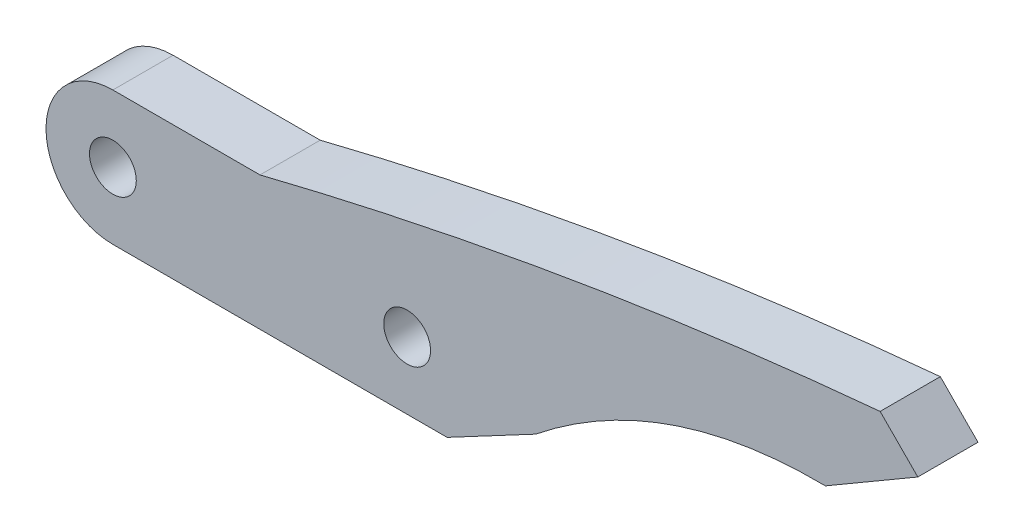
ISO-10303-21;
HEADER;
FILE_DESCRIPTION(('STEP AP214'),'2;1');
FILE_NAME('part.step','',(''),(''),'','','');
FILE_SCHEMA(('AUTOMOTIVE_DESIGN { 1 0 10303 214 1 1 1 1 }'));
ENDSEC;
DATA;
#1=APPLICATION_CONTEXT('core data for automotive mechanical design processes');
#2=APPLICATION_PROTOCOL_DEFINITION('international standard','automotive_design',2000,#1);
#3=PRODUCT_CONTEXT('',#1,'mechanical');
#4=PRODUCT('Part','Part','',(#3));
#5=PRODUCT_RELATED_PRODUCT_CATEGORY('part','',(#4));
#6=PRODUCT_DEFINITION_FORMATION('','',#4);
#7=PRODUCT_DEFINITION_CONTEXT('part definition',#1,'design');
#8=PRODUCT_DEFINITION('design','',#6,#7);
#9=PRODUCT_DEFINITION_SHAPE('','',#8);
#10=(LENGTH_UNIT() NAMED_UNIT(*) SI_UNIT(.MILLI.,.METRE.));
#11=(NAMED_UNIT(*) PLANE_ANGLE_UNIT() SI_UNIT($,.RADIAN.));
#12=(NAMED_UNIT(*) SI_UNIT($,.STERADIAN.) SOLID_ANGLE_UNIT());
#13=UNCERTAINTY_MEASURE_WITH_UNIT(LENGTH_MEASURE(1.E-05),#10,'distance_accuracy_value','');
#14=(GEOMETRIC_REPRESENTATION_CONTEXT(3) GLOBAL_UNCERTAINTY_ASSIGNED_CONTEXT((#13)) GLOBAL_UNIT_ASSIGNED_CONTEXT((#10,
#11,#12)) REPRESENTATION_CONTEXT('',''));
#15=CARTESIAN_POINT('',(0.,0.,0.));
#16=DIRECTION('',(0.,0.,1.));
#17=DIRECTION('',(1.,0.,0.));
#18=AXIS2_PLACEMENT_3D('',#15,#16,#17);
#19=CARTESIAN_POINT('',(0.,5.,-4.5));
#20=DIRECTION('',(0.,-1.,0.));
#21=DIRECTION('',(0.,0.,-1.));
#22=AXIS2_PLACEMENT_3D('',#19,#20,#21);
#23=PLANE('',#22);
#24=DIRECTION('',(0.,0.,1.));
#25=VECTOR('',#24,1.);
#26=CARTESIAN_POINT('',(0.,5.,-56.8267387246767));
#27=LINE('',#26,#25);
#28=CARTESIAN_POINT('',(0.,5.,-4.5));
#29=VERTEX_POINT('',#28);
#30=CARTESIAN_POINT('',(0.,5.,0.));
#31=VERTEX_POINT('',#30);
#32=EDGE_CURVE('E54',#29,#31,#27,.T.);
#33=ORIENTED_EDGE('',*,*,#32,.F.);
#34=DIRECTION('',(1.,0.,0.));
#35=VECTOR('',#34,1.);
#36=CARTESIAN_POINT('',(0.,5.,-4.5));
#37=LINE('',#36,#35);
#38=CARTESIAN_POINT('',(-11.,5.,-4.5));
#39=VERTEX_POINT('',#38);
#40=EDGE_CURVE('E75',#39,#29,#37,.T.);
#41=ORIENTED_EDGE('',*,*,#40,.F.);
#42=DIRECTION('',(0.,0.,1.));
#43=VECTOR('',#42,1.);
#44=CARTESIAN_POINT('',(-11.,5.,-4.5));
#45=LINE('',#44,#43);
#46=CARTESIAN_POINT('',(-11.,5.,0.));
#47=VERTEX_POINT('',#46);
#48=EDGE_CURVE('E11',#39,#47,#45,.T.);
#49=ORIENTED_EDGE('',*,*,#48,.T.);
#50=DIRECTION('',(1.,0.,0.));
#51=VECTOR('',#50,1.);
#52=CARTESIAN_POINT('',(0.,5.,0.));
#53=LINE('',#52,#51);
#54=EDGE_CURVE('E72',#47,#31,#53,.T.);
#55=ORIENTED_EDGE('',*,*,#54,.T.);
#56=EDGE_LOOP('',(#33,#41,#49,#55));
#57=FACE_BOUND('',#56,.T.);
#58=ADVANCED_FACE('F37',(#57),#23,.F.);
#59=CARTESIAN_POINT('',(-11.,0.,-4.5));
#60=DIRECTION('',(0.,0.,1.));
#61=DIRECTION('',(1.,0.,0.));
#62=AXIS2_PLACEMENT_3D('',#59,#60,#61);
#63=CYLINDRICAL_SURFACE('',#62,5.);
#64=CARTESIAN_POINT('',(-11.,0.,0.));
#65=DIRECTION('',(0.,0.,1.));
#66=DIRECTION('',(1.,0.,0.));
#67=AXIS2_PLACEMENT_3D('',#64,#65,#66);
#68=CIRCLE('',#67,5.);
#69=CARTESIAN_POINT('',(-11.,-5.,0.));
#70=VERTEX_POINT('',#69);
#71=EDGE_CURVE('E81',#47,#70,#68,.T.);
#72=ORIENTED_EDGE('',*,*,#71,.F.);
#73=ORIENTED_EDGE('',*,*,#48,.F.);
#74=CARTESIAN_POINT('',(-11.,0.,-4.5));
#75=DIRECTION('',(0.,0.,1.));
#76=DIRECTION('',(1.,0.,0.));
#77=AXIS2_PLACEMENT_3D('',#74,#75,#76);
#78=CIRCLE('',#77,5.);
#79=CARTESIAN_POINT('',(-11.,-5.,-4.5));
#80=VERTEX_POINT('',#79);
#81=EDGE_CURVE('E101',#39,#80,#78,.T.);
#82=ORIENTED_EDGE('',*,*,#81,.T.);
#83=DIRECTION('',(0.,0.,1.));
#84=VECTOR('',#83,1.);
#85=CARTESIAN_POINT('',(-11.,-5.,-4.5));
#86=LINE('',#85,#84);
#87=EDGE_CURVE('E42',#80,#70,#86,.T.);
#88=ORIENTED_EDGE('',*,*,#87,.T.);
#89=EDGE_LOOP('',(#72,#73,#82,#88));
#90=FACE_BOUND('',#89,.T.);
#91=ADVANCED_FACE('F90',(#90),#63,.T.);
#92=CARTESIAN_POINT('',(0.,-5.,-4.5));
#93=DIRECTION('',(0.,-1.,0.));
#94=DIRECTION('',(0.,0.,-1.));
#95=AXIS2_PLACEMENT_3D('',#92,#93,#94);
#96=PLANE('',#95);
#97=DIRECTION('',(1.,0.,0.));
#98=VECTOR('',#97,1.);
#99=CARTESIAN_POINT('',(0.,-5.,0.));
#100=LINE('',#99,#98);
#101=CARTESIAN_POINT('',(13.99,-5.,0.));
#102=VERTEX_POINT('',#101);
#103=EDGE_CURVE('E89',#70,#102,#100,.T.);
#104=ORIENTED_EDGE('',*,*,#103,.F.);
#105=ORIENTED_EDGE('',*,*,#87,.F.);
#106=DIRECTION('',(1.,0.,0.));
#107=VECTOR('',#106,1.);
#108=CARTESIAN_POINT('',(0.,-5.,-4.5));
#109=LINE('',#108,#107);
#110=CARTESIAN_POINT('',(13.99,-5.,-4.5));
#111=VERTEX_POINT('',#110);
#112=EDGE_CURVE('E110',#80,#111,#109,.T.);
#113=ORIENTED_EDGE('',*,*,#112,.T.);
#114=DIRECTION('',(0.,0.,1.));
#115=VECTOR('',#114,1.);
#116=CARTESIAN_POINT('',(13.99,-5.,-56.8267387246767));
#117=LINE('',#116,#115);
#118=EDGE_CURVE('E153',#111,#102,#117,.T.);
#119=ORIENTED_EDGE('',*,*,#118,.T.);
#120=EDGE_LOOP('',(#104,#105,#113,#119));
#121=FACE_BOUND('',#120,.T.);
#122=ADVANCED_FACE('F136',(#121),#96,.T.);
#123=CARTESIAN_POINT('',(-11.,0.,-4.5));
#124=DIRECTION('',(0.,0.,1.));
#125=DIRECTION('',(1.,0.,0.));
#126=AXIS2_PLACEMENT_3D('',#123,#124,#125);
#127=CYLINDRICAL_SURFACE('',#126,1.75);
#128=CARTESIAN_POINT('',(-11.,0.,-4.5));
#129=DIRECTION('',(0.,0.,1.));
#130=DIRECTION('',(1.,0.,0.));
#131=AXIS2_PLACEMENT_3D('',#128,#129,#130);
#132=CIRCLE('',#131,1.75);
#133=CARTESIAN_POINT('',(-9.25,0.,-4.5));
#134=VERTEX_POINT('',#133);
#135=EDGE_CURVE('E99',#134,#134,#132,.T.);
#136=ORIENTED_EDGE('',*,*,#135,.F.);
#137=EDGE_LOOP('',(#136));
#138=FACE_BOUND('',#137,.T.);
#139=CARTESIAN_POINT('',(-11.,0.,0.));
#140=DIRECTION('',(0.,0.,1.));
#141=DIRECTION('',(1.,0.,0.));
#142=AXIS2_PLACEMENT_3D('',#139,#140,#141);
#143=CIRCLE('',#142,1.75);
#144=CARTESIAN_POINT('',(-9.25,0.,0.));
#145=VERTEX_POINT('',#144);
#146=EDGE_CURVE('E91',#145,#145,#143,.T.);
#147=ORIENTED_EDGE('',*,*,#146,.T.);
#148=EDGE_LOOP('',(#147));
#149=FACE_BOUND('',#148,.T.);
#150=ADVANCED_FACE('F45',(#138,#149),#127,.F.);
#151=CARTESIAN_POINT('',(11.,0.,-4.5));
#152=DIRECTION('',(0.,0.,1.));
#153=DIRECTION('',(1.,0.,0.));
#154=AXIS2_PLACEMENT_3D('',#151,#152,#153);
#155=CYLINDRICAL_SURFACE('',#154,1.75);
#156=CARTESIAN_POINT('',(11.,0.,-4.5));
#157=DIRECTION('',(0.,0.,1.));
#158=DIRECTION('',(1.,0.,0.));
#159=AXIS2_PLACEMENT_3D('',#156,#157,#158);
#160=CIRCLE('',#159,1.75);
#161=CARTESIAN_POINT('',(12.75,0.,-4.5));
#162=VERTEX_POINT('',#161);
#163=EDGE_CURVE('E112',#162,#162,#160,.F.);
#164=ORIENTED_EDGE('',*,*,#163,.T.);
#165=EDGE_LOOP('',(#164));
#166=FACE_BOUND('',#165,.T.);
#167=CARTESIAN_POINT('',(11.,0.,0.));
#168=DIRECTION('',(0.,0.,1.));
#169=DIRECTION('',(1.,0.,0.));
#170=AXIS2_PLACEMENT_3D('',#167,#168,#169);
#171=CIRCLE('',#170,1.75);
#172=CARTESIAN_POINT('',(12.75,0.,0.));
#173=VERTEX_POINT('',#172);
#174=EDGE_CURVE('E88',#173,#173,#171,.F.);
#175=ORIENTED_EDGE('',*,*,#174,.F.);
#176=EDGE_LOOP('',(#175));
#177=FACE_BOUND('',#176,.T.);
#178=ADVANCED_FACE('F117',(#166,#177),#155,.F.);
#179=CARTESIAN_POINT('',(0.,0.,-4.5));
#180=DIRECTION('',(0.,0.,1.));
#181=DIRECTION('',(1.,0.,0.));
#182=AXIS2_PLACEMENT_3D('',#179,#180,#181);
#183=PLANE('',#182);
#184=ORIENTED_EDGE('',*,*,#40,.T.);
#185=CARTESIAN_POINT('',(46.3639891994318,12.87,-4.5));
#186=CARTESIAN_POINT('',(22.8855175011126,10.7079266509718,-4.5));
#187=CARTESIAN_POINT('',(0.,5.,-4.5));
#188=B_SPLINE_CURVE_WITH_KNOTS('',2,(#185,#186,#187),.UNSPECIFIED.,.F.,.F.,(3,3),(0.,1.),.UNSPECIFIED.);
#189=CARTESIAN_POINT('',(46.3639891994318,12.87,-4.5));
#190=VERTEX_POINT('',#189);
#191=EDGE_CURVE('E94',#29,#190,#188,.F.);
#192=ORIENTED_EDGE('',*,*,#191,.T.);
#193=DIRECTION('',(0.70420167565833,-0.71,0.));
#194=VECTOR('',#193,1.);
#195=CARTESIAN_POINT('',(46.3639891994318,12.87,-4.5));
#196=LINE('',#195,#194);
#197=CARTESIAN_POINT('',(49.1807959020651,10.03,-4.5));
#198=VERTEX_POINT('',#197);
#199=EDGE_CURVE('E183',#190,#198,#196,.T.);
#200=ORIENTED_EDGE('',*,*,#199,.T.);
#201=DIRECTION('',(-0.86384948775814,-0.50375,0.));
#202=VECTOR('',#201,1.);
#203=CARTESIAN_POINT('',(49.1807959020651,10.03,-4.5));
#204=LINE('',#203,#202);
#205=CARTESIAN_POINT('',(42.27,6.,-4.5));
#206=VERTEX_POINT('',#205);
#207=EDGE_CURVE('E192',#198,#206,#204,.T.);
#208=ORIENTED_EDGE('',*,*,#207,.T.);
#209=CARTESIAN_POINT('',(20.61,-1.48,-4.5));
#210=CARTESIAN_POINT('',(30.1461507480521,6.15734830451268,-4.5));
#211=CARTESIAN_POINT('',(42.27,6.,-4.5));
#212=B_SPLINE_CURVE_WITH_KNOTS('',2,(#209,#210,#211),.UNSPECIFIED.,.F.,.F.,(3,3),(0.,1.),.UNSPECIFIED.);
#213=CARTESIAN_POINT('',(20.61,-1.48,-4.5));
#214=VERTEX_POINT('',#213);
#215=EDGE_CURVE('E196',#206,#214,#212,.F.);
#216=ORIENTED_EDGE('',*,*,#215,.T.);
#217=DIRECTION('',(-0.882942972945771,-0.469480251475697,0.));
#218=VECTOR('',#217,1.);
#219=CARTESIAN_POINT('',(20.61,-1.48,-4.5));
#220=LINE('',#219,#218);
#221=EDGE_CURVE('E199',#214,#111,#220,.T.);
#222=ORIENTED_EDGE('',*,*,#221,.T.);
#223=ORIENTED_EDGE('',*,*,#112,.F.);
#224=ORIENTED_EDGE('',*,*,#81,.F.);
#225=EDGE_LOOP('',(#184,#192,#200,#208,#216,#222,#223,#224));
#226=FACE_BOUND('',#225,.T.);
#227=ORIENTED_EDGE('',*,*,#135,.T.);
#228=EDGE_LOOP('',(#227));
#229=FACE_BOUND('',#228,.T.);
#230=ORIENTED_EDGE('',*,*,#163,.F.);
#231=EDGE_LOOP('',(#230));
#232=FACE_BOUND('',#231,.T.);
#233=ADVANCED_FACE('F122',(#226,#229,#232),#183,.F.);
#234=CARTESIAN_POINT('',(0.,0.,0.));
#235=DIRECTION('',(0.,0.,1.));
#236=DIRECTION('',(1.,0.,0.));
#237=AXIS2_PLACEMENT_3D('',#234,#235,#236);
#238=PLANE('',#237);
#239=ORIENTED_EDGE('',*,*,#146,.F.);
#240=EDGE_LOOP('',(#239));
#241=FACE_BOUND('',#240,.T.);
#242=ORIENTED_EDGE('',*,*,#71,.T.);
#243=ORIENTED_EDGE('',*,*,#103,.T.);
#244=DIRECTION('',(0.882942972945771,0.469480251475697,0.));
#245=VECTOR('',#244,1.);
#246=CARTESIAN_POINT('',(20.61,-1.48,0.));
#247=LINE('',#246,#245);
#248=CARTESIAN_POINT('',(20.61,-1.48,0.));
#249=VERTEX_POINT('',#248);
#250=EDGE_CURVE('E156',#102,#249,#247,.T.);
#251=ORIENTED_EDGE('',*,*,#250,.T.);
#252=CARTESIAN_POINT('',(20.61,-1.48,0.));
#253=CARTESIAN_POINT('',(30.1461507480521,6.15734830451268,0.));
#254=CARTESIAN_POINT('',(42.27,6.,0.));
#255=B_SPLINE_CURVE_WITH_KNOTS('',2,(#252,#253,#254),.UNSPECIFIED.,.F.,.F.,(3,3),(0.,1.),.UNSPECIFIED.);
#256=CARTESIAN_POINT('',(42.27,6.,0.));
#257=VERTEX_POINT('',#256);
#258=EDGE_CURVE('E211',#249,#257,#255,.T.);
#259=ORIENTED_EDGE('',*,*,#258,.T.);
#260=DIRECTION('',(0.86384948775814,0.50375,0.));
#261=VECTOR('',#260,1.);
#262=CARTESIAN_POINT('',(49.1807959020651,10.03,0.));
#263=LINE('',#262,#261);
#264=CARTESIAN_POINT('',(49.1807959020651,10.03,0.));
#265=VERTEX_POINT('',#264);
#266=EDGE_CURVE('E208',#257,#265,#263,.T.);
#267=ORIENTED_EDGE('',*,*,#266,.T.);
#268=DIRECTION('',(-0.70420167565833,0.71,0.));
#269=VECTOR('',#268,1.);
#270=CARTESIAN_POINT('',(46.3639891994318,12.87,0.));
#271=LINE('',#270,#269);
#272=CARTESIAN_POINT('',(46.3639891994318,12.87,0.));
#273=VERTEX_POINT('',#272);
#274=EDGE_CURVE('E201',#265,#273,#271,.T.);
#275=ORIENTED_EDGE('',*,*,#274,.T.);
#276=CARTESIAN_POINT('',(46.3639891994318,12.87,0.));
#277=CARTESIAN_POINT('',(22.8855175011126,10.7079266509718,0.));
#278=CARTESIAN_POINT('',(0.,5.,0.));
#279=B_SPLINE_CURVE_WITH_KNOTS('',2,(#276,#277,#278),.UNSPECIFIED.,.F.,.F.,(3,3),(0.,1.),.UNSPECIFIED.);
#280=EDGE_CURVE('E82',#273,#31,#279,.T.);
#281=ORIENTED_EDGE('',*,*,#280,.T.);
#282=ORIENTED_EDGE('',*,*,#54,.F.);
#283=EDGE_LOOP('',(#242,#243,#251,#259,#267,#275,#281,#282));
#284=FACE_BOUND('',#283,.T.);
#285=ORIENTED_EDGE('',*,*,#174,.T.);
#286=EDGE_LOOP('',(#285));
#287=FACE_BOUND('',#286,.T.);
#288=ADVANCED_FACE('F79',(#241,#284,#287),#238,.T.);
#289=CARTESIAN_POINT('',(46.3639891994318,12.87,-56.8267387246767));
#290=CARTESIAN_POINT('',(22.8855175011126,10.7079266509718,-56.8267387246767));
#291=CARTESIAN_POINT('',(0.,5.,-56.8267387246767));
#292=B_SPLINE_CURVE_WITH_KNOTS('',2,(#289,#290,#291),.UNSPECIFIED.,.F.,.F.,(3,3),(0.,1.),.UNSPECIFIED.);
#293=DIRECTION('',(0.,0.,1.));
#294=VECTOR('',#293,1.);
#295=SURFACE_OF_LINEAR_EXTRUSION('',#292,#294);
#296=ORIENTED_EDGE('',*,*,#191,.F.);
#297=ORIENTED_EDGE('',*,*,#32,.T.);
#298=ORIENTED_EDGE('',*,*,#280,.F.);
#299=DIRECTION('',(0.,0.,1.));
#300=VECTOR('',#299,1.);
#301=CARTESIAN_POINT('',(46.3639891994318,12.87,-56.8267387246767));
#302=LINE('',#301,#300);
#303=EDGE_CURVE('E195',#190,#273,#302,.T.);
#304=ORIENTED_EDGE('',*,*,#303,.F.);
#305=EDGE_LOOP('',(#296,#297,#298,#304));
#306=FACE_BOUND('',#305,.T.);
#307=ADVANCED_FACE('F128',(#306),#295,.T.);
#308=CARTESIAN_POINT('',(46.3639891994318,12.87,-56.8267387246767));
#309=DIRECTION('',(0.71,0.70420167565833,0.));
#310=DIRECTION('',(-0.70420167565833,0.71,0.));
#311=AXIS2_PLACEMENT_3D('',#308,#309,#310);
#312=PLANE('',#311);
#313=ORIENTED_EDGE('',*,*,#199,.F.);
#314=ORIENTED_EDGE('',*,*,#303,.T.);
#315=ORIENTED_EDGE('',*,*,#274,.F.);
#316=DIRECTION('',(0.,0.,1.));
#317=VECTOR('',#316,1.);
#318=CARTESIAN_POINT('',(49.1807959020651,10.03,-56.8267387246767));
#319=LINE('',#318,#317);
#320=EDGE_CURVE('E193',#198,#265,#319,.T.);
#321=ORIENTED_EDGE('',*,*,#320,.F.);
#322=EDGE_LOOP('',(#313,#314,#315,#321));
#323=FACE_BOUND('',#322,.T.);
#324=ADVANCED_FACE('F194',(#323),#312,.T.);
#325=CARTESIAN_POINT('',(49.1807959020651,10.03,-56.8267387246767));
#326=DIRECTION('',(0.50375,-0.863849487758139,0.));
#327=DIRECTION('',(0.86384948775814,0.50375,0.));
#328=AXIS2_PLACEMENT_3D('',#325,#326,#327);
#329=PLANE('',#328);
#330=ORIENTED_EDGE('',*,*,#207,.F.);
#331=ORIENTED_EDGE('',*,*,#320,.T.);
#332=ORIENTED_EDGE('',*,*,#266,.F.);
#333=DIRECTION('',(0.,0.,1.));
#334=VECTOR('',#333,1.);
#335=CARTESIAN_POINT('',(42.27,6.,-56.8267387246767));
#336=LINE('',#335,#334);
#337=EDGE_CURVE('E204',#206,#257,#336,.T.);
#338=ORIENTED_EDGE('',*,*,#337,.F.);
#339=EDGE_LOOP('',(#330,#331,#332,#338));
#340=FACE_BOUND('',#339,.T.);
#341=ADVANCED_FACE('F242',(#340),#329,.T.);
#342=CARTESIAN_POINT('',(20.61,-1.48,-56.8267387246767));
#343=CARTESIAN_POINT('',(30.1461507480521,6.15734830451268,-56.8267387246767));
#344=CARTESIAN_POINT('',(42.27,6.,-56.8267387246767));
#345=B_SPLINE_CURVE_WITH_KNOTS('',2,(#342,#343,#344),.UNSPECIFIED.,.F.,.F.,(3,3),(0.,1.),.UNSPECIFIED.);
#346=DIRECTION('',(0.,0.,1.));
#347=VECTOR('',#346,1.);
#348=SURFACE_OF_LINEAR_EXTRUSION('',#345,#347);
#349=ORIENTED_EDGE('',*,*,#215,.F.);
#350=ORIENTED_EDGE('',*,*,#337,.T.);
#351=ORIENTED_EDGE('',*,*,#258,.F.);
#352=DIRECTION('',(0.,0.,1.));
#353=VECTOR('',#352,1.);
#354=CARTESIAN_POINT('',(20.61,-1.48,-56.8267387246767));
#355=LINE('',#354,#353);
#356=EDGE_CURVE('E209',#214,#249,#355,.T.);
#357=ORIENTED_EDGE('',*,*,#356,.F.);
#358=EDGE_LOOP('',(#349,#350,#351,#357));
#359=FACE_BOUND('',#358,.T.);
#360=ADVANCED_FACE('F237',(#359),#348,.T.);
#361=CARTESIAN_POINT('',(20.61,-1.48,-56.8267387246767));
#362=DIRECTION('',(0.469480251475697,-0.882942972945771,0.));
#363=DIRECTION('',(0.882942972945771,0.469480251475697,0.));
#364=AXIS2_PLACEMENT_3D('',#361,#362,#363);
#365=PLANE('',#364);
#366=ORIENTED_EDGE('',*,*,#221,.F.);
#367=ORIENTED_EDGE('',*,*,#356,.T.);
#368=ORIENTED_EDGE('',*,*,#250,.F.);
#369=ORIENTED_EDGE('',*,*,#118,.F.);
#370=EDGE_LOOP('',(#366,#367,#368,#369));
#371=FACE_BOUND('',#370,.T.);
#372=ADVANCED_FACE('F243',(#371),#365,.T.);
#373=CLOSED_SHELL('',(#58,#91,#122,#150,#178,#233,#288,#307,#324,#341,#360,#372));
#374=MANIFOLD_SOLID_BREP('B2',#373);
#375=ADVANCED_BREP_SHAPE_REPRESENTATION('',(#18,#374),#14);
#376=SHAPE_DEFINITION_REPRESENTATION(#9,#375);
ENDSEC;
END-ISO-10303-21;
